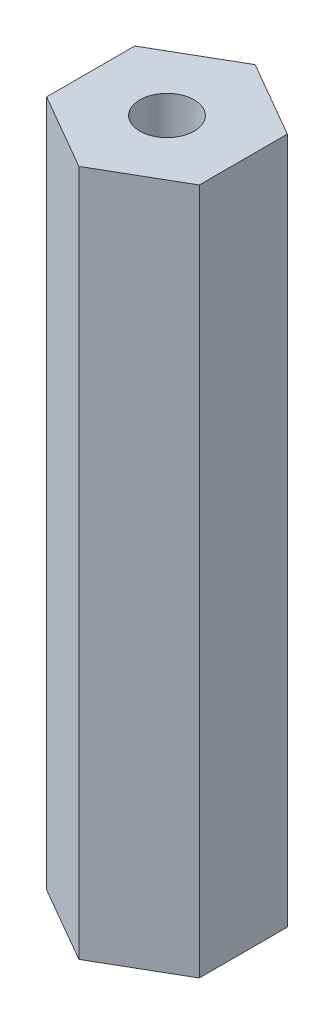
ISO-10303-21;
HEADER;
FILE_DESCRIPTION(('STEP AP214'),'2;1');
FILE_NAME('part.step','',(''),(''),'','','');
FILE_SCHEMA(('AUTOMOTIVE_DESIGN { 1 0 10303 214 1 1 1 1 }'));
ENDSEC;
DATA;
#1=APPLICATION_CONTEXT('core data for automotive mechanical design processes');
#2=APPLICATION_PROTOCOL_DEFINITION('international standard','automotive_design',2000,#1);
#3=PRODUCT_CONTEXT('',#1,'mechanical');
#4=PRODUCT('Part','Part','',(#3));
#5=PRODUCT_RELATED_PRODUCT_CATEGORY('part','',(#4));
#6=PRODUCT_DEFINITION_FORMATION('','',#4);
#7=PRODUCT_DEFINITION_CONTEXT('part definition',#1,'design');
#8=PRODUCT_DEFINITION('design','',#6,#7);
#9=PRODUCT_DEFINITION_SHAPE('','',#8);
#10=(LENGTH_UNIT() NAMED_UNIT(*) SI_UNIT(.MILLI.,.METRE.));
#11=(NAMED_UNIT(*) PLANE_ANGLE_UNIT() SI_UNIT($,.RADIAN.));
#12=(NAMED_UNIT(*) SI_UNIT($,.STERADIAN.) SOLID_ANGLE_UNIT());
#13=UNCERTAINTY_MEASURE_WITH_UNIT(LENGTH_MEASURE(1.E-05),#10,'distance_accuracy_value','');
#14=(GEOMETRIC_REPRESENTATION_CONTEXT(3) GLOBAL_UNCERTAINTY_ASSIGNED_CONTEXT((#13)) GLOBAL_UNIT_ASSIGNED_CONTEXT((#10,
#11,#12)) REPRESENTATION_CONTEXT('',''));
#15=CARTESIAN_POINT('',(0.,0.,0.));
#16=DIRECTION('',(0.,0.,1.));
#17=DIRECTION('',(1.,0.,0.));
#18=AXIS2_PLACEMENT_3D('',#15,#16,#17);
#19=CARTESIAN_POINT('',(3.175,28.575,-1.83308710467706));
#20=DIRECTION('',(-0.5,0.,0.866025403784439));
#21=DIRECTION('',(0.866025403784439,0.,0.5));
#22=AXIS2_PLACEMENT_3D('',#19,#20,#21);
#23=PLANE('',#22);
#24=DIRECTION('',(-0.866025403784439,0.,-0.5));
#25=VECTOR('',#24,1.);
#26=CARTESIAN_POINT('',(3.175,0.,-1.83308710467706));
#27=LINE('',#26,#25);
#28=CARTESIAN_POINT('',(3.175,0.,-1.83308710467706));
#29=VERTEX_POINT('',#28);
#30=CARTESIAN_POINT('',(0.,0.,-3.66617420935412));
#31=VERTEX_POINT('',#30);
#32=EDGE_CURVE('E118',#29,#31,#27,.T.);
#33=ORIENTED_EDGE('',*,*,#32,.T.);
#34=DIRECTION('',(0.,-1.,0.));
#35=VECTOR('',#34,1.);
#36=CARTESIAN_POINT('',(0.,28.575,-3.66617420935412));
#37=LINE('',#36,#35);
#38=CARTESIAN_POINT('',(0.,28.575,-3.66617420935412));
#39=VERTEX_POINT('',#38);
#40=EDGE_CURVE('E11',#39,#31,#37,.T.);
#41=ORIENTED_EDGE('',*,*,#40,.F.);
#42=DIRECTION('',(-0.866025403784439,0.,-0.5));
#43=VECTOR('',#42,1.);
#44=CARTESIAN_POINT('',(3.175,28.575,-1.83308710467706));
#45=LINE('',#44,#43);
#46=CARTESIAN_POINT('',(3.175,28.575,-1.83308710467706));
#47=VERTEX_POINT('',#46);
#48=EDGE_CURVE('E129',#47,#39,#45,.T.);
#49=ORIENTED_EDGE('',*,*,#48,.F.);
#50=DIRECTION('',(0.,-1.,0.));
#51=VECTOR('',#50,1.);
#52=CARTESIAN_POINT('',(3.175,28.575,-1.83308710467706));
#53=LINE('',#52,#51);
#54=EDGE_CURVE('E114',#47,#29,#53,.T.);
#55=ORIENTED_EDGE('',*,*,#54,.T.);
#56=EDGE_LOOP('',(#33,#41,#49,#55));
#57=FACE_BOUND('',#56,.T.);
#58=ADVANCED_FACE('F34',(#57),#23,.F.);
#59=CARTESIAN_POINT('',(0.,28.575,-3.66617420935412));
#60=DIRECTION('',(0.5,0.,0.866025403784439));
#61=DIRECTION('',(0.866025403784439,0.,-0.5));
#62=AXIS2_PLACEMENT_3D('',#59,#60,#61);
#63=PLANE('',#62);
#64=DIRECTION('',(-0.866025403784439,0.,0.5));
#65=VECTOR('',#64,1.);
#66=CARTESIAN_POINT('',(0.,0.,-3.66617420935412));
#67=LINE('',#66,#65);
#68=CARTESIAN_POINT('',(-3.175,0.,-1.83308710467706));
#69=VERTEX_POINT('',#68);
#70=EDGE_CURVE('E121',#31,#69,#67,.T.);
#71=ORIENTED_EDGE('',*,*,#70,.T.);
#72=DIRECTION('',(0.,-1.,0.));
#73=VECTOR('',#72,1.);
#74=CARTESIAN_POINT('',(-3.175,28.575,-1.83308710467706));
#75=LINE('',#74,#73);
#76=CARTESIAN_POINT('',(-3.175,28.575,-1.83308710467706));
#77=VERTEX_POINT('',#76);
#78=EDGE_CURVE('E42',#77,#69,#75,.T.);
#79=ORIENTED_EDGE('',*,*,#78,.F.);
#80=DIRECTION('',(-0.866025403784439,0.,0.5));
#81=VECTOR('',#80,1.);
#82=CARTESIAN_POINT('',(0.,28.575,-3.66617420935412));
#83=LINE('',#82,#81);
#84=EDGE_CURVE('E87',#39,#77,#83,.T.);
#85=ORIENTED_EDGE('',*,*,#84,.F.);
#86=ORIENTED_EDGE('',*,*,#40,.T.);
#87=EDGE_LOOP('',(#71,#79,#85,#86));
#88=FACE_BOUND('',#87,.T.);
#89=ADVANCED_FACE('F154',(#88),#63,.F.);
#90=CARTESIAN_POINT('',(-3.175,28.575,-1.83308710467706));
#91=DIRECTION('',(1.,0.,0.));
#92=DIRECTION('',(0.,0.,-1.));
#93=AXIS2_PLACEMENT_3D('',#90,#91,#92);
#94=PLANE('',#93);
#95=DIRECTION('',(0.,0.,1.));
#96=VECTOR('',#95,1.);
#97=CARTESIAN_POINT('',(-3.175,0.,-1.83308710467706));
#98=LINE('',#97,#96);
#99=CARTESIAN_POINT('',(-3.175,0.,1.83308710467707));
#100=VERTEX_POINT('',#99);
#101=EDGE_CURVE('E124',#69,#100,#98,.T.);
#102=ORIENTED_EDGE('',*,*,#101,.T.);
#103=DIRECTION('',(0.,-1.,0.));
#104=VECTOR('',#103,1.);
#105=CARTESIAN_POINT('',(-3.175,28.575,1.83308710467707));
#106=LINE('',#105,#104);
#107=CARTESIAN_POINT('',(-3.175,28.575,1.83308710467707));
#108=VERTEX_POINT('',#107);
#109=EDGE_CURVE('E109',#108,#100,#106,.T.);
#110=ORIENTED_EDGE('',*,*,#109,.F.);
#111=DIRECTION('',(0.,0.,1.));
#112=VECTOR('',#111,1.);
#113=CARTESIAN_POINT('',(-3.175,28.575,-1.83308710467706));
#114=LINE('',#113,#112);
#115=EDGE_CURVE('E100',#77,#108,#114,.T.);
#116=ORIENTED_EDGE('',*,*,#115,.F.);
#117=ORIENTED_EDGE('',*,*,#78,.T.);
#118=EDGE_LOOP('',(#102,#110,#116,#117));
#119=FACE_BOUND('',#118,.T.);
#120=ADVANCED_FACE('F135',(#119),#94,.F.);
#121=CARTESIAN_POINT('',(-3.175,28.575,1.83308710467707));
#122=DIRECTION('',(0.5,0.,-0.866025403784439));
#123=DIRECTION('',(-0.866025403784439,0.,-0.5));
#124=AXIS2_PLACEMENT_3D('',#121,#122,#123);
#125=PLANE('',#124);
#126=DIRECTION('',(0.866025403784439,0.,0.5));
#127=VECTOR('',#126,1.);
#128=CARTESIAN_POINT('',(-3.175,0.,1.83308710467707));
#129=LINE('',#128,#127);
#130=CARTESIAN_POINT('',(0.,0.,3.66617420935413));
#131=VERTEX_POINT('',#130);
#132=EDGE_CURVE('E108',#100,#131,#129,.T.);
#133=ORIENTED_EDGE('',*,*,#132,.T.);
#134=DIRECTION('',(0.,-1.,0.));
#135=VECTOR('',#134,1.);
#136=CARTESIAN_POINT('',(0.,28.575,3.66617420935413));
#137=LINE('',#136,#135);
#138=CARTESIAN_POINT('',(0.,28.575,3.66617420935413));
#139=VERTEX_POINT('',#138);
#140=EDGE_CURVE('E105',#139,#131,#137,.T.);
#141=ORIENTED_EDGE('',*,*,#140,.F.);
#142=DIRECTION('',(0.866025403784439,0.,0.5));
#143=VECTOR('',#142,1.);
#144=CARTESIAN_POINT('',(-3.175,28.575,1.83308710467707));
#145=LINE('',#144,#143);
#146=EDGE_CURVE('E94',#108,#139,#145,.T.);
#147=ORIENTED_EDGE('',*,*,#146,.F.);
#148=ORIENTED_EDGE('',*,*,#109,.T.);
#149=EDGE_LOOP('',(#133,#141,#147,#148));
#150=FACE_BOUND('',#149,.T.);
#151=ADVANCED_FACE('F106',(#150),#125,.F.);
#152=CARTESIAN_POINT('',(0.,28.575,3.66617420935413));
#153=DIRECTION('',(-0.5,0.,-0.866025403784439));
#154=DIRECTION('',(-0.866025403784439,0.,0.5));
#155=AXIS2_PLACEMENT_3D('',#152,#153,#154);
#156=PLANE('',#155);
#157=DIRECTION('',(0.866025403784439,0.,-0.5));
#158=VECTOR('',#157,1.);
#159=CARTESIAN_POINT('',(0.,0.,3.66617420935413));
#160=LINE('',#159,#158);
#161=CARTESIAN_POINT('',(3.175,0.,1.83308710467707));
#162=VERTEX_POINT('',#161);
#163=EDGE_CURVE('E73',#131,#162,#160,.T.);
#164=ORIENTED_EDGE('',*,*,#163,.T.);
#165=DIRECTION('',(0.,-1.,0.));
#166=VECTOR('',#165,1.);
#167=CARTESIAN_POINT('',(3.175,28.575,1.83308710467707));
#168=LINE('',#167,#166);
#169=CARTESIAN_POINT('',(3.175,28.575,1.83308710467707));
#170=VERTEX_POINT('',#169);
#171=EDGE_CURVE('E110',#170,#162,#168,.T.);
#172=ORIENTED_EDGE('',*,*,#171,.F.);
#173=DIRECTION('',(0.866025403784439,0.,-0.5));
#174=VECTOR('',#173,1.);
#175=CARTESIAN_POINT('',(0.,28.575,3.66617420935413));
#176=LINE('',#175,#174);
#177=EDGE_CURVE('E98',#139,#170,#176,.T.);
#178=ORIENTED_EDGE('',*,*,#177,.F.);
#179=ORIENTED_EDGE('',*,*,#140,.T.);
#180=EDGE_LOOP('',(#164,#172,#178,#179));
#181=FACE_BOUND('',#180,.T.);
#182=ADVANCED_FACE('F112',(#181),#156,.F.);
#183=CARTESIAN_POINT('',(3.175,28.575,1.83308710467707));
#184=DIRECTION('',(-1.,0.,0.));
#185=DIRECTION('',(0.,0.,1.));
#186=AXIS2_PLACEMENT_3D('',#183,#184,#185);
#187=PLANE('',#186);
#188=DIRECTION('',(0.,0.,-1.));
#189=VECTOR('',#188,1.);
#190=CARTESIAN_POINT('',(3.175,0.,1.83308710467707));
#191=LINE('',#190,#189);
#192=EDGE_CURVE('E79',#162,#29,#191,.T.);
#193=ORIENTED_EDGE('',*,*,#192,.T.);
#194=ORIENTED_EDGE('',*,*,#54,.F.);
#195=DIRECTION('',(0.,0.,-1.));
#196=VECTOR('',#195,1.);
#197=CARTESIAN_POINT('',(3.175,28.575,1.83308710467707));
#198=LINE('',#197,#196);
#199=EDGE_CURVE('E50',#170,#47,#198,.T.);
#200=ORIENTED_EDGE('',*,*,#199,.F.);
#201=ORIENTED_EDGE('',*,*,#171,.T.);
#202=EDGE_LOOP('',(#193,#194,#200,#201));
#203=FACE_BOUND('',#202,.T.);
#204=ADVANCED_FACE('F142',(#203),#187,.F.);
#205=CARTESIAN_POINT('',(0.,28.575,-3.66617420935412));
#206=DIRECTION('',(0.,1.,0.));
#207=DIRECTION('',(0.,0.,1.));
#208=AXIS2_PLACEMENT_3D('',#205,#206,#207);
#209=PLANE('',#208);
#210=CARTESIAN_POINT('',(0.,28.575,0.));
#211=DIRECTION('',(0.,1.,0.));
#212=DIRECTION('',(0.,0.,1.));
#213=AXIS2_PLACEMENT_3D('',#210,#211,#212);
#214=CIRCLE('',#213,1.13029999999999);
#215=CARTESIAN_POINT('',(0.,28.575,1.13029999999999));
#216=VERTEX_POINT('',#215);
#217=EDGE_CURVE('E211',#216,#216,#214,.T.);
#218=ORIENTED_EDGE('',*,*,#217,.F.);
#219=EDGE_LOOP('',(#218));
#220=FACE_BOUND('',#219,.T.);
#221=ORIENTED_EDGE('',*,*,#48,.T.);
#222=ORIENTED_EDGE('',*,*,#84,.T.);
#223=ORIENTED_EDGE('',*,*,#115,.T.);
#224=ORIENTED_EDGE('',*,*,#146,.T.);
#225=ORIENTED_EDGE('',*,*,#177,.T.);
#226=ORIENTED_EDGE('',*,*,#199,.T.);
#227=EDGE_LOOP('',(#221,#222,#223,#224,#225,#226));
#228=FACE_BOUND('',#227,.T.);
#229=ADVANCED_FACE('F96',(#220,#228),#209,.T.);
#230=CARTESIAN_POINT('',(0.,0.,-3.66617420935412));
#231=DIRECTION('',(0.,1.,0.));
#232=DIRECTION('',(0.,0.,1.));
#233=AXIS2_PLACEMENT_3D('',#230,#231,#232);
#234=PLANE('',#233);
#235=CARTESIAN_POINT('',(0.,0.,0.));
#236=DIRECTION('',(0.,1.,0.));
#237=DIRECTION('',(0.,0.,1.));
#238=AXIS2_PLACEMENT_3D('',#235,#236,#237);
#239=CIRCLE('',#238,1.13029999999999);
#240=CARTESIAN_POINT('',(0.,0.,1.13029999999999));
#241=VERTEX_POINT('',#240);
#242=EDGE_CURVE('E122',#241,#241,#239,.T.);
#243=ORIENTED_EDGE('',*,*,#242,.T.);
#244=EDGE_LOOP('',(#243));
#245=FACE_BOUND('',#244,.T.);
#246=ORIENTED_EDGE('',*,*,#32,.F.);
#247=ORIENTED_EDGE('',*,*,#192,.F.);
#248=ORIENTED_EDGE('',*,*,#163,.F.);
#249=ORIENTED_EDGE('',*,*,#132,.F.);
#250=ORIENTED_EDGE('',*,*,#101,.F.);
#251=ORIENTED_EDGE('',*,*,#70,.F.);
#252=EDGE_LOOP('',(#246,#247,#248,#249,#250,#251));
#253=FACE_BOUND('',#252,.T.);
#254=ADVANCED_FACE('F138',(#245,#253),#234,.F.);
#255=CARTESIAN_POINT('',(0.,28.575,0.));
#256=DIRECTION('',(0.,1.,0.));
#257=DIRECTION('',(0.,0.,1.));
#258=AXIS2_PLACEMENT_3D('',#255,#256,#257);
#259=CYLINDRICAL_SURFACE('',#258,1.13029999999999);
#260=ORIENTED_EDGE('',*,*,#242,.F.);
#261=EDGE_LOOP('',(#260));
#262=FACE_BOUND('',#261,.T.);
#263=ORIENTED_EDGE('',*,*,#217,.T.);
#264=EDGE_LOOP('',(#263));
#265=FACE_BOUND('',#264,.T.);
#266=ADVANCED_FACE('F191',(#262,#265),#259,.F.);
#267=CLOSED_SHELL('',(#58,#89,#120,#151,#182,#204,#229,#254,#266));
#268=MANIFOLD_SOLID_BREP('B2',#267);
#269=ADVANCED_BREP_SHAPE_REPRESENTATION('',(#18,#268),#14);
#270=SHAPE_DEFINITION_REPRESENTATION(#9,#269);
ENDSEC;
END-ISO-10303-21;
